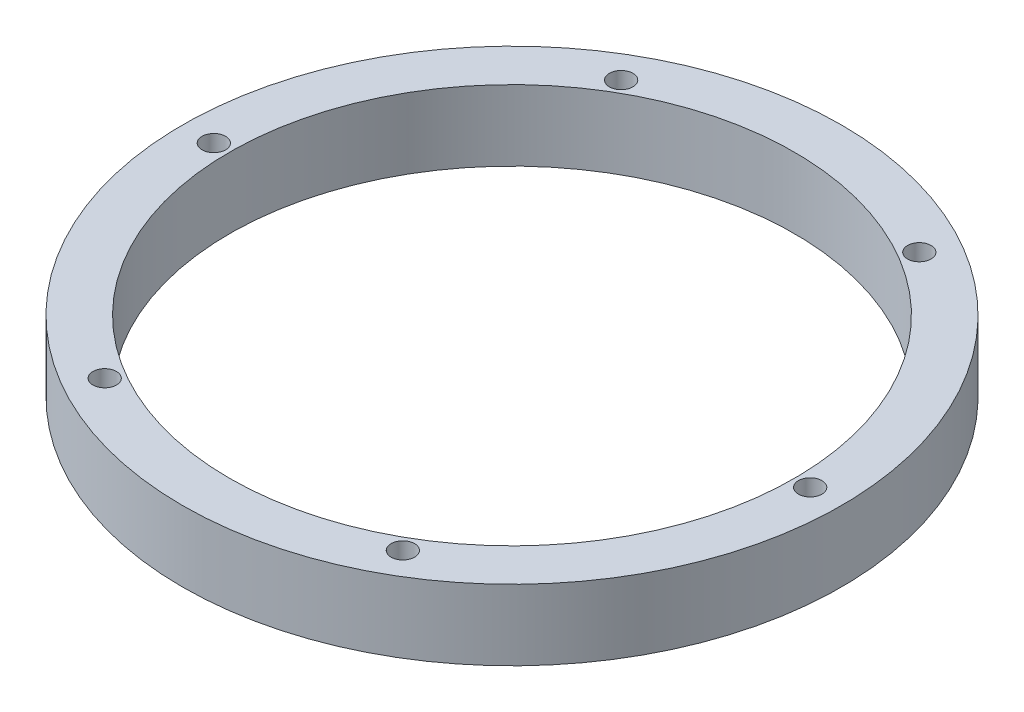
ISO-10303-21;
HEADER;
FILE_DESCRIPTION(('STEP AP214'),'2;1');
FILE_NAME('part.step','',(''),(''),'','','');
FILE_SCHEMA(('AUTOMOTIVE_DESIGN { 1 0 10303 214 1 1 1 1 }'));
ENDSEC;
DATA;
#1=APPLICATION_CONTEXT('core data for automotive mechanical design processes');
#2=APPLICATION_PROTOCOL_DEFINITION('international standard','automotive_design',2000,#1);
#3=PRODUCT_CONTEXT('',#1,'mechanical');
#4=PRODUCT('Part','Part','',(#3));
#5=PRODUCT_RELATED_PRODUCT_CATEGORY('part','',(#4));
#6=PRODUCT_DEFINITION_FORMATION('','',#4);
#7=PRODUCT_DEFINITION_CONTEXT('part definition',#1,'design');
#8=PRODUCT_DEFINITION('design','',#6,#7);
#9=PRODUCT_DEFINITION_SHAPE('','',#8);
#10=(LENGTH_UNIT() NAMED_UNIT(*) SI_UNIT(.MILLI.,.METRE.));
#11=(NAMED_UNIT(*) PLANE_ANGLE_UNIT() SI_UNIT($,.RADIAN.));
#12=(NAMED_UNIT(*) SI_UNIT($,.STERADIAN.) SOLID_ANGLE_UNIT());
#13=UNCERTAINTY_MEASURE_WITH_UNIT(LENGTH_MEASURE(1.E-05),#10,'distance_accuracy_value','');
#14=(GEOMETRIC_REPRESENTATION_CONTEXT(3) GLOBAL_UNCERTAINTY_ASSIGNED_CONTEXT((#13)) GLOBAL_UNIT_ASSIGNED_CONTEXT((#10,
#11,#12)) REPRESENTATION_CONTEXT('',''));
#15=CARTESIAN_POINT('',(0.,0.,0.));
#16=DIRECTION('',(0.,0.,1.));
#17=DIRECTION('',(1.,0.,0.));
#18=AXIS2_PLACEMENT_3D('',#15,#16,#17);
#19=CARTESIAN_POINT('',(0.,9.,0.));
#20=DIRECTION('',(0.,1.,0.));
#21=DIRECTION('',(0.,0.,1.));
#22=AXIS2_PLACEMENT_3D('',#19,#20,#21);
#23=PLANE('',#22);
#24=CARTESIAN_POINT('',(19.0000000000001,9.,-32.9089653438086));
#25=DIRECTION('',(0.,1.,0.));
#26=DIRECTION('',(0.,0.,1.));
#27=AXIS2_PLACEMENT_3D('',#24,#25,#26);
#28=CIRCLE('',#27,1.5);
#29=CARTESIAN_POINT('',(19.0000000000001,9.,-31.4089653438086));
#30=VERTEX_POINT('',#29);
#31=EDGE_CURVE('E70',#30,#30,#28,.T.);
#32=ORIENTED_EDGE('',*,*,#31,.F.);
#33=EDGE_LOOP('',(#32));
#34=FACE_BOUND('',#33,.T.);
#35=CARTESIAN_POINT('',(-38.,9.,0.));
#36=DIRECTION('',(0.,1.,0.));
#37=DIRECTION('',(0.,0.,1.));
#38=AXIS2_PLACEMENT_3D('',#35,#36,#37);
#39=CIRCLE('',#38,1.5);
#40=CARTESIAN_POINT('',(-38.,9.,1.5));
#41=VERTEX_POINT('',#40);
#42=EDGE_CURVE('E58',#41,#41,#39,.T.);
#43=ORIENTED_EDGE('',*,*,#42,.F.);
#44=EDGE_LOOP('',(#43));
#45=FACE_BOUND('',#44,.T.);
#46=CARTESIAN_POINT('',(18.9999999999999,9.,32.9089653438087));
#47=DIRECTION('',(0.,1.,0.));
#48=DIRECTION('',(0.,0.,1.));
#49=AXIS2_PLACEMENT_3D('',#46,#47,#48);
#50=CIRCLE('',#49,1.5);
#51=CARTESIAN_POINT('',(18.9999999999999,9.,34.4089653438087));
#52=VERTEX_POINT('',#51);
#53=EDGE_CURVE('E46',#52,#52,#50,.T.);
#54=ORIENTED_EDGE('',*,*,#53,.F.);
#55=EDGE_LOOP('',(#54));
#56=FACE_BOUND('',#55,.T.);
#57=CARTESIAN_POINT('',(0.,9.,0.));
#58=DIRECTION('',(0.,1.,0.));
#59=DIRECTION('',(0.,0.,1.));
#60=AXIS2_PLACEMENT_3D('',#57,#58,#59);
#61=CIRCLE('',#60,42.);
#62=CARTESIAN_POINT('',(0.,9.,42.));
#63=VERTEX_POINT('',#62);
#64=EDGE_CURVE('E10',#63,#63,#61,.T.);
#65=ORIENTED_EDGE('',*,*,#64,.T.);
#66=EDGE_LOOP('',(#65));
#67=FACE_BOUND('',#66,.T.);
#68=CARTESIAN_POINT('',(0.,9.,0.));
#69=DIRECTION('',(0.,1.,0.));
#70=DIRECTION('',(0.,0.,1.));
#71=AXIS2_PLACEMENT_3D('',#68,#69,#70);
#72=CIRCLE('',#71,36.);
#73=CARTESIAN_POINT('',(0.,9.,36.));
#74=VERTEX_POINT('',#73);
#75=EDGE_CURVE('E41',#74,#74,#72,.T.);
#76=ORIENTED_EDGE('',*,*,#75,.F.);
#77=EDGE_LOOP('',(#76));
#78=FACE_BOUND('',#77,.T.);
#79=CARTESIAN_POINT('',(-19.0000000000001,9.,32.9089653438086));
#80=DIRECTION('',(0.,1.,0.));
#81=DIRECTION('',(0.,0.,1.));
#82=AXIS2_PLACEMENT_3D('',#79,#80,#81);
#83=CIRCLE('',#82,1.49999999999999);
#84=CARTESIAN_POINT('',(-19.0000000000001,9.,34.4089653438086));
#85=VERTEX_POINT('',#84);
#86=EDGE_CURVE('E52',#85,#85,#83,.T.);
#87=ORIENTED_EDGE('',*,*,#86,.F.);
#88=EDGE_LOOP('',(#87));
#89=FACE_BOUND('',#88,.T.);
#90=CARTESIAN_POINT('',(-18.9999999999999,9.,-32.9089653438087));
#91=DIRECTION('',(0.,1.,0.));
#92=DIRECTION('',(0.,0.,1.));
#93=AXIS2_PLACEMENT_3D('',#90,#91,#92);
#94=CIRCLE('',#93,1.5);
#95=CARTESIAN_POINT('',(-18.9999999999999,9.,-31.4089653438087));
#96=VERTEX_POINT('',#95);
#97=EDGE_CURVE('E64',#96,#96,#94,.T.);
#98=ORIENTED_EDGE('',*,*,#97,.F.);
#99=EDGE_LOOP('',(#98));
#100=FACE_BOUND('',#99,.T.);
#101=CARTESIAN_POINT('',(38.,9.,0.));
#102=DIRECTION('',(0.,1.,0.));
#103=DIRECTION('',(0.,0.,1.));
#104=AXIS2_PLACEMENT_3D('',#101,#102,#103);
#105=CIRCLE('',#104,1.5);
#106=CARTESIAN_POINT('',(38.,9.,1.5));
#107=VERTEX_POINT('',#106);
#108=EDGE_CURVE('E76',#107,#107,#105,.T.);
#109=ORIENTED_EDGE('',*,*,#108,.F.);
#110=EDGE_LOOP('',(#109));
#111=FACE_BOUND('',#110,.T.);
#112=ADVANCED_FACE('F30',(#34,#45,#56,#67,#78,#89,#100,#111),#23,.T.);
#113=CARTESIAN_POINT('',(0.,0.,0.));
#114=DIRECTION('',(0.,1.,0.));
#115=DIRECTION('',(0.,0.,1.));
#116=AXIS2_PLACEMENT_3D('',#113,#114,#115);
#117=PLANE('',#116);
#118=CARTESIAN_POINT('',(0.,0.,0.));
#119=DIRECTION('',(0.,1.,0.));
#120=DIRECTION('',(0.,0.,1.));
#121=AXIS2_PLACEMENT_3D('',#118,#119,#120);
#122=CIRCLE('',#121,42.);
#123=CARTESIAN_POINT('',(0.,0.,42.));
#124=VERTEX_POINT('',#123);
#125=EDGE_CURVE('E34',#124,#124,#122,.T.);
#126=ORIENTED_EDGE('',*,*,#125,.F.);
#127=EDGE_LOOP('',(#126));
#128=FACE_BOUND('',#127,.T.);
#129=CARTESIAN_POINT('',(0.,0.,0.));
#130=DIRECTION('',(0.,1.,0.));
#131=DIRECTION('',(0.,0.,1.));
#132=AXIS2_PLACEMENT_3D('',#129,#130,#131);
#133=CIRCLE('',#132,36.);
#134=CARTESIAN_POINT('',(0.,0.,36.));
#135=VERTEX_POINT('',#134);
#136=EDGE_CURVE('E43',#135,#135,#133,.T.);
#137=ORIENTED_EDGE('',*,*,#136,.T.);
#138=EDGE_LOOP('',(#137));
#139=FACE_BOUND('',#138,.T.);
#140=CARTESIAN_POINT('',(18.9999999999999,0.,32.9089653438087));
#141=DIRECTION('',(0.,1.,0.));
#142=DIRECTION('',(0.,0.,1.));
#143=AXIS2_PLACEMENT_3D('',#140,#141,#142);
#144=CIRCLE('',#143,1.5);
#145=CARTESIAN_POINT('',(18.9999999999999,0.,34.4089653438087));
#146=VERTEX_POINT('',#145);
#147=EDGE_CURVE('E49',#146,#146,#144,.T.);
#148=ORIENTED_EDGE('',*,*,#147,.T.);
#149=EDGE_LOOP('',(#148));
#150=FACE_BOUND('',#149,.T.);
#151=CARTESIAN_POINT('',(-19.0000000000001,0.,32.9089653438086));
#152=DIRECTION('',(0.,1.,0.));
#153=DIRECTION('',(0.,0.,1.));
#154=AXIS2_PLACEMENT_3D('',#151,#152,#153);
#155=CIRCLE('',#154,1.49999999999999);
#156=CARTESIAN_POINT('',(-19.0000000000001,0.,34.4089653438086));
#157=VERTEX_POINT('',#156);
#158=EDGE_CURVE('E55',#157,#157,#155,.T.);
#159=ORIENTED_EDGE('',*,*,#158,.T.);
#160=EDGE_LOOP('',(#159));
#161=FACE_BOUND('',#160,.T.);
#162=CARTESIAN_POINT('',(-38.,0.,0.));
#163=DIRECTION('',(0.,1.,0.));
#164=DIRECTION('',(0.,0.,1.));
#165=AXIS2_PLACEMENT_3D('',#162,#163,#164);
#166=CIRCLE('',#165,1.5);
#167=CARTESIAN_POINT('',(-38.,0.,1.5));
#168=VERTEX_POINT('',#167);
#169=EDGE_CURVE('E61',#168,#168,#166,.T.);
#170=ORIENTED_EDGE('',*,*,#169,.T.);
#171=EDGE_LOOP('',(#170));
#172=FACE_BOUND('',#171,.T.);
#173=CARTESIAN_POINT('',(-18.9999999999999,0.,-32.9089653438087));
#174=DIRECTION('',(0.,1.,0.));
#175=DIRECTION('',(0.,0.,1.));
#176=AXIS2_PLACEMENT_3D('',#173,#174,#175);
#177=CIRCLE('',#176,1.5);
#178=CARTESIAN_POINT('',(-18.9999999999999,0.,-31.4089653438087));
#179=VERTEX_POINT('',#178);
#180=EDGE_CURVE('E67',#179,#179,#177,.T.);
#181=ORIENTED_EDGE('',*,*,#180,.T.);
#182=EDGE_LOOP('',(#181));
#183=FACE_BOUND('',#182,.T.);
#184=CARTESIAN_POINT('',(19.0000000000001,0.,-32.9089653438086));
#185=DIRECTION('',(0.,1.,0.));
#186=DIRECTION('',(0.,0.,1.));
#187=AXIS2_PLACEMENT_3D('',#184,#185,#186);
#188=CIRCLE('',#187,1.5);
#189=CARTESIAN_POINT('',(19.0000000000001,0.,-31.4089653438086));
#190=VERTEX_POINT('',#189);
#191=EDGE_CURVE('E73',#190,#190,#188,.T.);
#192=ORIENTED_EDGE('',*,*,#191,.T.);
#193=EDGE_LOOP('',(#192));
#194=FACE_BOUND('',#193,.T.);
#195=CARTESIAN_POINT('',(38.,0.,0.));
#196=DIRECTION('',(0.,1.,0.));
#197=DIRECTION('',(0.,0.,1.));
#198=AXIS2_PLACEMENT_3D('',#195,#196,#197);
#199=CIRCLE('',#198,1.5);
#200=CARTESIAN_POINT('',(38.,0.,1.5));
#201=VERTEX_POINT('',#200);
#202=EDGE_CURVE('E79',#201,#201,#199,.T.);
#203=ORIENTED_EDGE('',*,*,#202,.T.);
#204=EDGE_LOOP('',(#203));
#205=FACE_BOUND('',#204,.T.);
#206=ADVANCED_FACE('F89',(#128,#139,#150,#161,#172,#183,#194,#205),#117,.F.);
#207=CARTESIAN_POINT('',(0.,9.,0.));
#208=DIRECTION('',(0.,-1.,0.));
#209=DIRECTION('',(0.,0.,-1.));
#210=AXIS2_PLACEMENT_3D('',#207,#208,#209);
#211=CYLINDRICAL_SURFACE('',#210,42.);
#212=ORIENTED_EDGE('',*,*,#64,.F.);
#213=EDGE_LOOP('',(#212));
#214=FACE_BOUND('',#213,.T.);
#215=ORIENTED_EDGE('',*,*,#125,.T.);
#216=EDGE_LOOP('',(#215));
#217=FACE_BOUND('',#216,.T.);
#218=ADVANCED_FACE('F32',(#214,#217),#211,.T.);
#219=CARTESIAN_POINT('',(0.,9.,0.));
#220=DIRECTION('',(0.,-1.,0.));
#221=DIRECTION('',(0.,0.,-1.));
#222=AXIS2_PLACEMENT_3D('',#219,#220,#221);
#223=CYLINDRICAL_SURFACE('',#222,36.);
#224=ORIENTED_EDGE('',*,*,#75,.T.);
#225=EDGE_LOOP('',(#224));
#226=FACE_BOUND('',#225,.T.);
#227=ORIENTED_EDGE('',*,*,#136,.F.);
#228=EDGE_LOOP('',(#227));
#229=FACE_BOUND('',#228,.T.);
#230=ADVANCED_FACE('F99',(#226,#229),#223,.F.);
#231=CARTESIAN_POINT('',(18.9999999999999,9.,32.9089653438087));
#232=DIRECTION('',(0.,-1.,0.));
#233=DIRECTION('',(0.,0.,-1.));
#234=AXIS2_PLACEMENT_3D('',#231,#232,#233);
#235=CYLINDRICAL_SURFACE('',#234,1.5);
#236=ORIENTED_EDGE('',*,*,#53,.T.);
#237=EDGE_LOOP('',(#236));
#238=FACE_BOUND('',#237,.T.);
#239=ORIENTED_EDGE('',*,*,#147,.F.);
#240=EDGE_LOOP('',(#239));
#241=FACE_BOUND('',#240,.T.);
#242=ADVANCED_FACE('F102',(#238,#241),#235,.F.);
#243=CARTESIAN_POINT('',(-19.0000000000001,9.,32.9089653438086));
#244=DIRECTION('',(0.,-1.,0.));
#245=DIRECTION('',(0.,0.,-1.));
#246=AXIS2_PLACEMENT_3D('',#243,#244,#245);
#247=CYLINDRICAL_SURFACE('',#246,1.49999999999999);
#248=ORIENTED_EDGE('',*,*,#86,.T.);
#249=EDGE_LOOP('',(#248));
#250=FACE_BOUND('',#249,.T.);
#251=ORIENTED_EDGE('',*,*,#158,.F.);
#252=EDGE_LOOP('',(#251));
#253=FACE_BOUND('',#252,.T.);
#254=ADVANCED_FACE('F106',(#250,#253),#247,.F.);
#255=CARTESIAN_POINT('',(-38.,9.,0.));
#256=DIRECTION('',(0.,-1.,0.));
#257=DIRECTION('',(0.,0.,-1.));
#258=AXIS2_PLACEMENT_3D('',#255,#256,#257);
#259=CYLINDRICAL_SURFACE('',#258,1.5);
#260=ORIENTED_EDGE('',*,*,#42,.T.);
#261=EDGE_LOOP('',(#260));
#262=FACE_BOUND('',#261,.T.);
#263=ORIENTED_EDGE('',*,*,#169,.F.);
#264=EDGE_LOOP('',(#263));
#265=FACE_BOUND('',#264,.T.);
#266=ADVANCED_FACE('F110',(#262,#265),#259,.F.);
#267=CARTESIAN_POINT('',(-18.9999999999999,9.,-32.9089653438087));
#268=DIRECTION('',(0.,-1.,0.));
#269=DIRECTION('',(0.,0.,-1.));
#270=AXIS2_PLACEMENT_3D('',#267,#268,#269);
#271=CYLINDRICAL_SURFACE('',#270,1.5);
#272=ORIENTED_EDGE('',*,*,#97,.T.);
#273=EDGE_LOOP('',(#272));
#274=FACE_BOUND('',#273,.T.);
#275=ORIENTED_EDGE('',*,*,#180,.F.);
#276=EDGE_LOOP('',(#275));
#277=FACE_BOUND('',#276,.T.);
#278=ADVANCED_FACE('F114',(#274,#277),#271,.F.);
#279=CARTESIAN_POINT('',(19.0000000000001,9.,-32.9089653438086));
#280=DIRECTION('',(0.,-1.,0.));
#281=DIRECTION('',(0.,0.,-1.));
#282=AXIS2_PLACEMENT_3D('',#279,#280,#281);
#283=CYLINDRICAL_SURFACE('',#282,1.5);
#284=ORIENTED_EDGE('',*,*,#31,.T.);
#285=EDGE_LOOP('',(#284));
#286=FACE_BOUND('',#285,.T.);
#287=ORIENTED_EDGE('',*,*,#191,.F.);
#288=EDGE_LOOP('',(#287));
#289=FACE_BOUND('',#288,.T.);
#290=ADVANCED_FACE('F118',(#286,#289),#283,.F.);
#291=CARTESIAN_POINT('',(38.,9.,0.));
#292=DIRECTION('',(0.,-1.,0.));
#293=DIRECTION('',(0.,0.,-1.));
#294=AXIS2_PLACEMENT_3D('',#291,#292,#293);
#295=CYLINDRICAL_SURFACE('',#294,1.5);
#296=ORIENTED_EDGE('',*,*,#108,.T.);
#297=EDGE_LOOP('',(#296));
#298=FACE_BOUND('',#297,.T.);
#299=ORIENTED_EDGE('',*,*,#202,.F.);
#300=EDGE_LOOP('',(#299));
#301=FACE_BOUND('',#300,.T.);
#302=ADVANCED_FACE('F85',(#298,#301),#295,.F.);
#303=CLOSED_SHELL('',(#112,#206,#218,#230,#242,#254,#266,#278,#290,#302));
#304=MANIFOLD_SOLID_BREP('B2',#303);
#305=ADVANCED_BREP_SHAPE_REPRESENTATION('',(#18,#304),#14);
#306=SHAPE_DEFINITION_REPRESENTATION(#9,#305);
ENDSEC;
END-ISO-10303-21;
